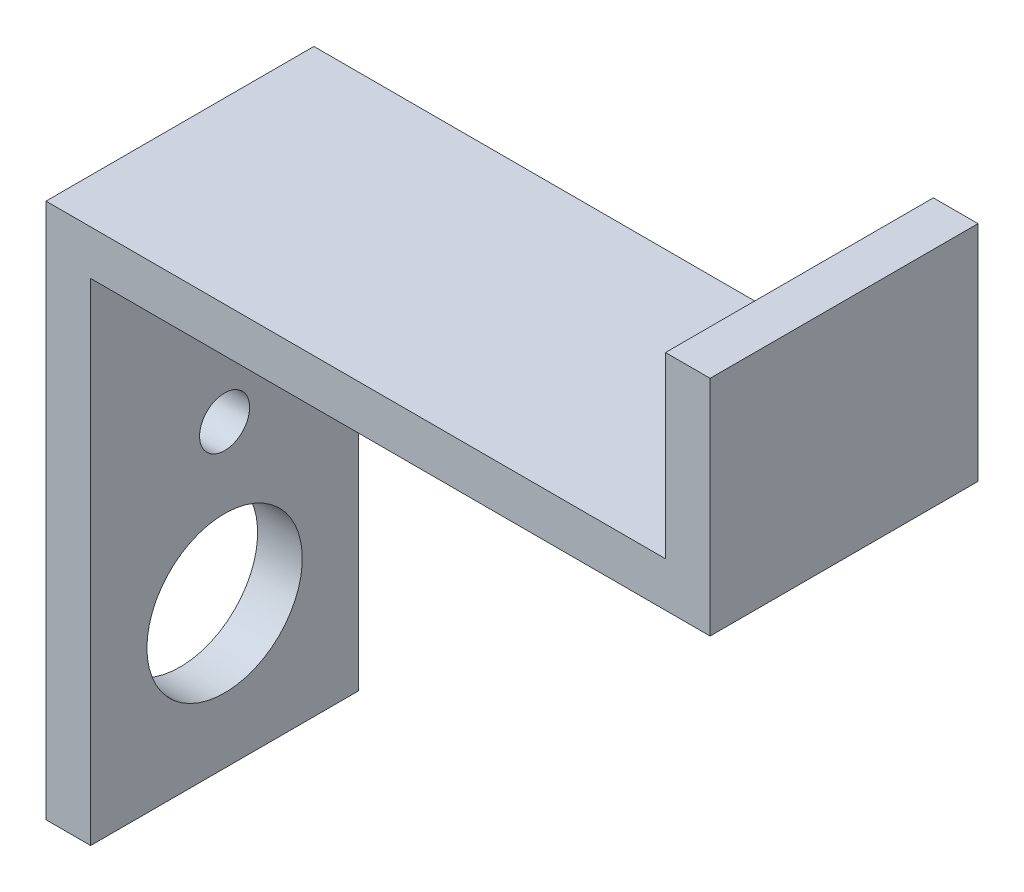
ISO-10303-21;
HEADER;
FILE_DESCRIPTION(('STEP AP214'),'2;1');
FILE_NAME('part.step','',(''),(''),'','','');
FILE_SCHEMA(('AUTOMOTIVE_DESIGN { 1 0 10303 214 1 1 1 1 }'));
ENDSEC;
DATA;
#1=APPLICATION_CONTEXT('core data for automotive mechanical design processes');
#2=APPLICATION_PROTOCOL_DEFINITION('international standard','automotive_design',2000,#1);
#3=PRODUCT_CONTEXT('',#1,'mechanical');
#4=PRODUCT('Part','Part','',(#3));
#5=PRODUCT_RELATED_PRODUCT_CATEGORY('part','',(#4));
#6=PRODUCT_DEFINITION_FORMATION('','',#4);
#7=PRODUCT_DEFINITION_CONTEXT('part definition',#1,'design');
#8=PRODUCT_DEFINITION('design','',#6,#7);
#9=PRODUCT_DEFINITION_SHAPE('','',#8);
#10=(LENGTH_UNIT() NAMED_UNIT(*) SI_UNIT(.MILLI.,.METRE.));
#11=(NAMED_UNIT(*) PLANE_ANGLE_UNIT() SI_UNIT($,.RADIAN.));
#12=(NAMED_UNIT(*) SI_UNIT($,.STERADIAN.) SOLID_ANGLE_UNIT());
#13=UNCERTAINTY_MEASURE_WITH_UNIT(LENGTH_MEASURE(1.E-05),#10,'distance_accuracy_value','');
#14=(GEOMETRIC_REPRESENTATION_CONTEXT(3) GLOBAL_UNCERTAINTY_ASSIGNED_CONTEXT((#13)) GLOBAL_UNIT_ASSIGNED_CONTEXT((#10,
#11,#12)) REPRESENTATION_CONTEXT('',''));
#15=CARTESIAN_POINT('',(0.,0.,0.));
#16=DIRECTION('',(0.,0.,1.));
#17=DIRECTION('',(1.,0.,0.));
#18=AXIS2_PLACEMENT_3D('',#15,#16,#17);
#19=CARTESIAN_POINT('',(0.,0.,38.1));
#20=DIRECTION('',(0.,1.,0.));
#21=DIRECTION('',(0.,0.,1.));
#22=AXIS2_PLACEMENT_3D('',#19,#20,#21);
#23=PLANE('',#22);
#24=DIRECTION('',(1.,0.,0.));
#25=VECTOR('',#24,1.);
#26=CARTESIAN_POINT('',(0.,0.,0.));
#27=LINE('',#26,#25);
#28=CARTESIAN_POINT('',(0.,0.,0.));
#29=VERTEX_POINT('',#28);
#30=CARTESIAN_POINT('',(6.35,0.,0.));
#31=VERTEX_POINT('',#30);
#32=EDGE_CURVE('E141',#29,#31,#27,.T.);
#33=ORIENTED_EDGE('',*,*,#32,.T.);
#34=DIRECTION('',(0.,0.,-1.));
#35=VECTOR('',#34,1.);
#36=CARTESIAN_POINT('',(6.35,0.,38.1));
#37=LINE('',#36,#35);
#38=CARTESIAN_POINT('',(6.35,0.,38.1));
#39=VERTEX_POINT('',#38);
#40=EDGE_CURVE('E11',#39,#31,#37,.T.);
#41=ORIENTED_EDGE('',*,*,#40,.F.);
#42=DIRECTION('',(1.,0.,0.));
#43=VECTOR('',#42,1.);
#44=CARTESIAN_POINT('',(0.,0.,38.1));
#45=LINE('',#44,#43);
#46=CARTESIAN_POINT('',(0.,0.,38.1));
#47=VERTEX_POINT('',#46);
#48=EDGE_CURVE('E169',#47,#39,#45,.T.);
#49=ORIENTED_EDGE('',*,*,#48,.F.);
#50=DIRECTION('',(0.,0.,-1.));
#51=VECTOR('',#50,1.);
#52=CARTESIAN_POINT('',(0.,0.,38.1));
#53=LINE('',#52,#51);
#54=EDGE_CURVE('E56',#47,#29,#53,.T.);
#55=ORIENTED_EDGE('',*,*,#54,.T.);
#56=EDGE_LOOP('',(#33,#41,#49,#55));
#57=FACE_BOUND('',#56,.T.);
#58=ADVANCED_FACE('F39',(#57),#23,.F.);
#59=CARTESIAN_POINT('',(6.35,0.,38.1));
#60=DIRECTION('',(-1.,0.,0.));
#61=DIRECTION('',(0.,0.,1.));
#62=AXIS2_PLACEMENT_3D('',#59,#60,#61);
#63=PLANE('',#62);
#64=CARTESIAN_POINT('',(6.35,42.672,19.05));
#65=DIRECTION('',(-1.,0.,0.));
#66=DIRECTION('',(0.,0.,1.));
#67=AXIS2_PLACEMENT_3D('',#64,#65,#66);
#68=CIRCLE('',#67,3.55600000000001);
#69=CARTESIAN_POINT('',(6.35,42.672,22.606));
#70=VERTEX_POINT('',#69);
#71=EDGE_CURVE('E211',#70,#70,#68,.T.);
#72=ORIENTED_EDGE('',*,*,#71,.T.);
#73=EDGE_LOOP('',(#72));
#74=FACE_BOUND('',#73,.T.);
#75=CARTESIAN_POINT('',(6.35,20.32,19.05));
#76=DIRECTION('',(-1.,0.,0.));
#77=DIRECTION('',(0.,0.,1.));
#78=AXIS2_PLACEMENT_3D('',#75,#76,#77);
#79=CIRCLE('',#78,11.049);
#80=CARTESIAN_POINT('',(6.35,20.32,30.099));
#81=VERTEX_POINT('',#80);
#82=EDGE_CURVE('E145',#81,#81,#79,.T.);
#83=ORIENTED_EDGE('',*,*,#82,.T.);
#84=EDGE_LOOP('',(#83));
#85=FACE_BOUND('',#84,.T.);
#86=DIRECTION('',(0.,1.,0.));
#87=VECTOR('',#86,1.);
#88=CARTESIAN_POINT('',(6.35,0.,0.));
#89=LINE('',#88,#87);
#90=CARTESIAN_POINT('',(6.35,69.85,0.));
#91=VERTEX_POINT('',#90);
#92=EDGE_CURVE('E144',#31,#91,#89,.T.);
#93=ORIENTED_EDGE('',*,*,#92,.T.);
#94=DIRECTION('',(0.,0.,-1.));
#95=VECTOR('',#94,1.);
#96=CARTESIAN_POINT('',(6.35,69.85,38.1));
#97=LINE('',#96,#95);
#98=CARTESIAN_POINT('',(6.35,69.85,38.1));
#99=VERTEX_POINT('',#98);
#100=EDGE_CURVE('E48',#99,#91,#97,.T.);
#101=ORIENTED_EDGE('',*,*,#100,.F.);
#102=DIRECTION('',(0.,1.,0.));
#103=VECTOR('',#102,1.);
#104=CARTESIAN_POINT('',(6.35,0.,38.1));
#105=LINE('',#104,#103);
#106=EDGE_CURVE('E94',#39,#99,#105,.T.);
#107=ORIENTED_EDGE('',*,*,#106,.F.);
#108=ORIENTED_EDGE('',*,*,#40,.T.);
#109=EDGE_LOOP('',(#93,#101,#107,#108));
#110=FACE_BOUND('',#109,.T.);
#111=ADVANCED_FACE('F223',(#74,#85,#110),#63,.F.);
#112=CARTESIAN_POINT('',(0.,69.85,38.1));
#113=DIRECTION('',(0.,1.,0.));
#114=DIRECTION('',(0.,0.,1.));
#115=AXIS2_PLACEMENT_3D('',#112,#113,#114);
#116=PLANE('',#115);
#117=DIRECTION('',(1.,0.,0.));
#118=VECTOR('',#117,1.);
#119=CARTESIAN_POINT('',(0.,69.85,0.));
#120=LINE('',#119,#118);
#121=CARTESIAN_POINT('',(94.447991823564,69.85,0.));
#122=VERTEX_POINT('',#121);
#123=EDGE_CURVE('E148',#91,#122,#120,.T.);
#124=ORIENTED_EDGE('',*,*,#123,.T.);
#125=DIRECTION('',(0.,0.,-1.));
#126=VECTOR('',#125,1.);
#127=CARTESIAN_POINT('',(94.447991823564,69.85,38.1));
#128=LINE('',#127,#126);
#129=CARTESIAN_POINT('',(94.447991823564,69.85,38.1));
#130=VERTEX_POINT('',#129);
#131=EDGE_CURVE('E179',#130,#122,#128,.T.);
#132=ORIENTED_EDGE('',*,*,#131,.F.);
#133=DIRECTION('',(1.,0.,0.));
#134=VECTOR('',#133,1.);
#135=CARTESIAN_POINT('',(0.,69.85,38.1));
#136=LINE('',#135,#134);
#137=EDGE_CURVE('E188',#99,#130,#136,.T.);
#138=ORIENTED_EDGE('',*,*,#137,.F.);
#139=ORIENTED_EDGE('',*,*,#100,.T.);
#140=EDGE_LOOP('',(#124,#132,#138,#139));
#141=FACE_BOUND('',#140,.T.);
#142=ADVANCED_FACE('F186',(#141),#116,.F.);
#143=CARTESIAN_POINT('',(94.447991823564,0.,38.1));
#144=DIRECTION('',(1.,0.,0.));
#145=DIRECTION('',(0.,0.,-1.));
#146=AXIS2_PLACEMENT_3D('',#143,#144,#145);
#147=PLANE('',#146);
#148=DIRECTION('',(0.,-1.,0.));
#149=VECTOR('',#148,1.);
#150=CARTESIAN_POINT('',(94.447991823564,0.,0.));
#151=LINE('',#150,#149);
#152=CARTESIAN_POINT('',(94.447991823564,101.6,0.));
#153=VERTEX_POINT('',#152);
#154=EDGE_CURVE('E152',#153,#122,#151,.T.);
#155=ORIENTED_EDGE('',*,*,#154,.F.);
#156=DIRECTION('',(0.,0.,-1.));
#157=VECTOR('',#156,1.);
#158=CARTESIAN_POINT('',(94.447991823564,101.6,38.1));
#159=LINE('',#158,#157);
#160=CARTESIAN_POINT('',(94.447991823564,101.6,38.1));
#161=VERTEX_POINT('',#160);
#162=EDGE_CURVE('E176',#161,#153,#159,.T.);
#163=ORIENTED_EDGE('',*,*,#162,.F.);
#164=DIRECTION('',(0.,-1.,0.));
#165=VECTOR('',#164,1.);
#166=CARTESIAN_POINT('',(94.447991823564,0.,38.1));
#167=LINE('',#166,#165);
#168=EDGE_CURVE('E196',#161,#130,#167,.T.);
#169=ORIENTED_EDGE('',*,*,#168,.T.);
#170=ORIENTED_EDGE('',*,*,#131,.T.);
#171=EDGE_LOOP('',(#155,#163,#169,#170));
#172=FACE_BOUND('',#171,.T.);
#173=ADVANCED_FACE('F194',(#172),#147,.T.);
#174=CARTESIAN_POINT('',(0.,101.6,38.1));
#175=DIRECTION('',(0.,1.,0.));
#176=DIRECTION('',(0.,0.,1.));
#177=AXIS2_PLACEMENT_3D('',#174,#175,#176);
#178=PLANE('',#177);
#179=DIRECTION('',(1.,0.,0.));
#180=VECTOR('',#179,1.);
#181=CARTESIAN_POINT('',(0.,101.6,0.));
#182=LINE('',#181,#180);
#183=CARTESIAN_POINT('',(88.097991823564,101.6,0.));
#184=VERTEX_POINT('',#183);
#185=EDGE_CURVE('E156',#184,#153,#182,.T.);
#186=ORIENTED_EDGE('',*,*,#185,.F.);
#187=DIRECTION('',(0.,0.,-1.));
#188=VECTOR('',#187,1.);
#189=CARTESIAN_POINT('',(88.097991823564,101.6,38.1));
#190=LINE('',#189,#188);
#191=CARTESIAN_POINT('',(88.097991823564,101.6,38.1));
#192=VERTEX_POINT('',#191);
#193=EDGE_CURVE('E120',#192,#184,#190,.T.);
#194=ORIENTED_EDGE('',*,*,#193,.F.);
#195=DIRECTION('',(1.,0.,0.));
#196=VECTOR('',#195,1.);
#197=CARTESIAN_POINT('',(0.,101.6,38.1));
#198=LINE('',#197,#196);
#199=EDGE_CURVE('E130',#192,#161,#198,.T.);
#200=ORIENTED_EDGE('',*,*,#199,.T.);
#201=ORIENTED_EDGE('',*,*,#162,.T.);
#202=EDGE_LOOP('',(#186,#194,#200,#201));
#203=FACE_BOUND('',#202,.T.);
#204=ADVANCED_FACE('F248',(#203),#178,.T.);
#205=CARTESIAN_POINT('',(88.097991823564,0.,38.1));
#206=DIRECTION('',(-1.,0.,0.));
#207=DIRECTION('',(0.,0.,1.));
#208=AXIS2_PLACEMENT_3D('',#205,#206,#207);
#209=PLANE('',#208);
#210=DIRECTION('',(0.,1.,0.));
#211=VECTOR('',#210,1.);
#212=CARTESIAN_POINT('',(88.097991823564,0.,0.));
#213=LINE('',#212,#211);
#214=CARTESIAN_POINT('',(88.097991823564,76.2,0.));
#215=VERTEX_POINT('',#214);
#216=EDGE_CURVE('E115',#215,#184,#213,.T.);
#217=ORIENTED_EDGE('',*,*,#216,.F.);
#218=DIRECTION('',(0.,0.,-1.));
#219=VECTOR('',#218,1.);
#220=CARTESIAN_POINT('',(88.097991823564,76.2,38.1));
#221=LINE('',#220,#219);
#222=CARTESIAN_POINT('',(88.097991823564,76.2,38.1));
#223=VERTEX_POINT('',#222);
#224=EDGE_CURVE('E110',#223,#215,#221,.T.);
#225=ORIENTED_EDGE('',*,*,#224,.F.);
#226=DIRECTION('',(0.,1.,0.));
#227=VECTOR('',#226,1.);
#228=CARTESIAN_POINT('',(88.097991823564,0.,38.1));
#229=LINE('',#228,#227);
#230=EDGE_CURVE('E113',#223,#192,#229,.T.);
#231=ORIENTED_EDGE('',*,*,#230,.T.);
#232=ORIENTED_EDGE('',*,*,#193,.T.);
#233=EDGE_LOOP('',(#217,#225,#231,#232));
#234=FACE_BOUND('',#233,.T.);
#235=ADVANCED_FACE('F112',(#234),#209,.T.);
#236=CARTESIAN_POINT('',(0.,76.2,38.1));
#237=DIRECTION('',(0.,1.,0.));
#238=DIRECTION('',(0.,0.,1.));
#239=AXIS2_PLACEMENT_3D('',#236,#237,#238);
#240=PLANE('',#239);
#241=DIRECTION('',(1.,0.,0.));
#242=VECTOR('',#241,1.);
#243=CARTESIAN_POINT('',(0.,76.2,0.));
#244=LINE('',#243,#242);
#245=CARTESIAN_POINT('',(0.,76.2,0.));
#246=VERTEX_POINT('',#245);
#247=EDGE_CURVE('E162',#246,#215,#244,.T.);
#248=ORIENTED_EDGE('',*,*,#247,.F.);
#249=DIRECTION('',(0.,0.,-1.));
#250=VECTOR('',#249,1.);
#251=CARTESIAN_POINT('',(0.,76.2,38.1));
#252=LINE('',#251,#250);
#253=CARTESIAN_POINT('',(0.,76.2,38.1));
#254=VERTEX_POINT('',#253);
#255=EDGE_CURVE('E82',#254,#246,#252,.T.);
#256=ORIENTED_EDGE('',*,*,#255,.F.);
#257=DIRECTION('',(1.,0.,0.));
#258=VECTOR('',#257,1.);
#259=CARTESIAN_POINT('',(0.,76.2,38.1));
#260=LINE('',#259,#258);
#261=EDGE_CURVE('E127',#254,#223,#260,.T.);
#262=ORIENTED_EDGE('',*,*,#261,.T.);
#263=ORIENTED_EDGE('',*,*,#224,.T.);
#264=EDGE_LOOP('',(#248,#256,#262,#263));
#265=FACE_BOUND('',#264,.T.);
#266=ADVANCED_FACE('F133',(#265),#240,.T.);
#267=CARTESIAN_POINT('',(0.,0.,38.1));
#268=DIRECTION('',(-1.,0.,0.));
#269=DIRECTION('',(0.,0.,1.));
#270=AXIS2_PLACEMENT_3D('',#267,#268,#269);
#271=PLANE('',#270);
#272=CARTESIAN_POINT('',(0.,42.672,19.05));
#273=DIRECTION('',(-1.,0.,0.));
#274=DIRECTION('',(0.,0.,1.));
#275=AXIS2_PLACEMENT_3D('',#272,#273,#274);
#276=CIRCLE('',#275,3.55600000000001);
#277=CARTESIAN_POINT('',(0.,42.672,22.606));
#278=VERTEX_POINT('',#277);
#279=EDGE_CURVE('E215',#278,#278,#276,.T.);
#280=ORIENTED_EDGE('',*,*,#279,.F.);
#281=EDGE_LOOP('',(#280));
#282=FACE_BOUND('',#281,.T.);
#283=CARTESIAN_POINT('',(0.,20.32,19.05));
#284=DIRECTION('',(-1.,0.,0.));
#285=DIRECTION('',(0.,0.,1.));
#286=AXIS2_PLACEMENT_3D('',#283,#284,#285);
#287=CIRCLE('',#286,11.049);
#288=CARTESIAN_POINT('',(0.,20.32,30.099));
#289=VERTEX_POINT('',#288);
#290=EDGE_CURVE('E207',#289,#289,#287,.T.);
#291=ORIENTED_EDGE('',*,*,#290,.F.);
#292=EDGE_LOOP('',(#291));
#293=FACE_BOUND('',#292,.T.);
#294=DIRECTION('',(0.,1.,0.));
#295=VECTOR('',#294,1.);
#296=CARTESIAN_POINT('',(0.,0.,0.));
#297=LINE('',#296,#295);
#298=EDGE_CURVE('E165',#29,#246,#297,.T.);
#299=ORIENTED_EDGE('',*,*,#298,.F.);
#300=ORIENTED_EDGE('',*,*,#54,.F.);
#301=DIRECTION('',(0.,1.,0.));
#302=VECTOR('',#301,1.);
#303=CARTESIAN_POINT('',(0.,0.,38.1));
#304=LINE('',#303,#302);
#305=EDGE_CURVE('E135',#47,#254,#304,.T.);
#306=ORIENTED_EDGE('',*,*,#305,.T.);
#307=ORIENTED_EDGE('',*,*,#255,.T.);
#308=EDGE_LOOP('',(#299,#300,#306,#307));
#309=FACE_BOUND('',#308,.T.);
#310=ADVANCED_FACE('F233',(#282,#293,#309),#271,.T.);
#311=CARTESIAN_POINT('',(0.,0.,38.1));
#312=DIRECTION('',(0.,0.,1.));
#313=DIRECTION('',(1.,0.,0.));
#314=AXIS2_PLACEMENT_3D('',#311,#312,#313);
#315=PLANE('',#314);
#316=ORIENTED_EDGE('',*,*,#48,.T.);
#317=ORIENTED_EDGE('',*,*,#106,.T.);
#318=ORIENTED_EDGE('',*,*,#137,.T.);
#319=ORIENTED_EDGE('',*,*,#168,.F.);
#320=ORIENTED_EDGE('',*,*,#199,.F.);
#321=ORIENTED_EDGE('',*,*,#230,.F.);
#322=ORIENTED_EDGE('',*,*,#261,.F.);
#323=ORIENTED_EDGE('',*,*,#305,.F.);
#324=EDGE_LOOP('',(#316,#317,#318,#319,#320,#321,#322,#323));
#325=FACE_BOUND('',#324,.T.);
#326=ADVANCED_FACE('F125',(#325),#315,.T.);
#327=CARTESIAN_POINT('',(0.,0.,0.));
#328=DIRECTION('',(0.,0.,1.));
#329=DIRECTION('',(1.,0.,0.));
#330=AXIS2_PLACEMENT_3D('',#327,#328,#329);
#331=PLANE('',#330);
#332=ORIENTED_EDGE('',*,*,#32,.F.);
#333=ORIENTED_EDGE('',*,*,#298,.T.);
#334=ORIENTED_EDGE('',*,*,#247,.T.);
#335=ORIENTED_EDGE('',*,*,#216,.T.);
#336=ORIENTED_EDGE('',*,*,#185,.T.);
#337=ORIENTED_EDGE('',*,*,#154,.T.);
#338=ORIENTED_EDGE('',*,*,#123,.F.);
#339=ORIENTED_EDGE('',*,*,#92,.F.);
#340=EDGE_LOOP('',(#332,#333,#334,#335,#336,#337,#338,#339));
#341=FACE_BOUND('',#340,.T.);
#342=ADVANCED_FACE('F190',(#341),#331,.F.);
#343=CARTESIAN_POINT('',(6.35,20.32,19.05));
#344=DIRECTION('',(-1.,0.,0.));
#345=DIRECTION('',(0.,0.,1.));
#346=AXIS2_PLACEMENT_3D('',#343,#344,#345);
#347=CYLINDRICAL_SURFACE('',#346,11.049);
#348=ORIENTED_EDGE('',*,*,#82,.F.);
#349=EDGE_LOOP('',(#348));
#350=FACE_BOUND('',#349,.T.);
#351=ORIENTED_EDGE('',*,*,#290,.T.);
#352=EDGE_LOOP('',(#351));
#353=FACE_BOUND('',#352,.T.);
#354=ADVANCED_FACE('F229',(#350,#353),#347,.F.);
#355=CARTESIAN_POINT('',(6.35,42.672,19.05));
#356=DIRECTION('',(-1.,0.,0.));
#357=DIRECTION('',(0.,0.,1.));
#358=AXIS2_PLACEMENT_3D('',#355,#356,#357);
#359=CYLINDRICAL_SURFACE('',#358,3.55600000000001);
#360=ORIENTED_EDGE('',*,*,#71,.F.);
#361=EDGE_LOOP('',(#360));
#362=FACE_BOUND('',#361,.T.);
#363=ORIENTED_EDGE('',*,*,#279,.T.);
#364=EDGE_LOOP('',(#363));
#365=FACE_BOUND('',#364,.T.);
#366=ADVANCED_FACE('F226',(#362,#365),#359,.F.);
#367=CLOSED_SHELL('',(#58,#111,#142,#173,#204,#235,#266,#310,#326,#342,#354,#366));
#368=MANIFOLD_SOLID_BREP('B2',#367);
#369=ADVANCED_BREP_SHAPE_REPRESENTATION('',(#18,#368),#14);
#370=SHAPE_DEFINITION_REPRESENTATION(#9,#369);
ENDSEC;
END-ISO-10303-21;
